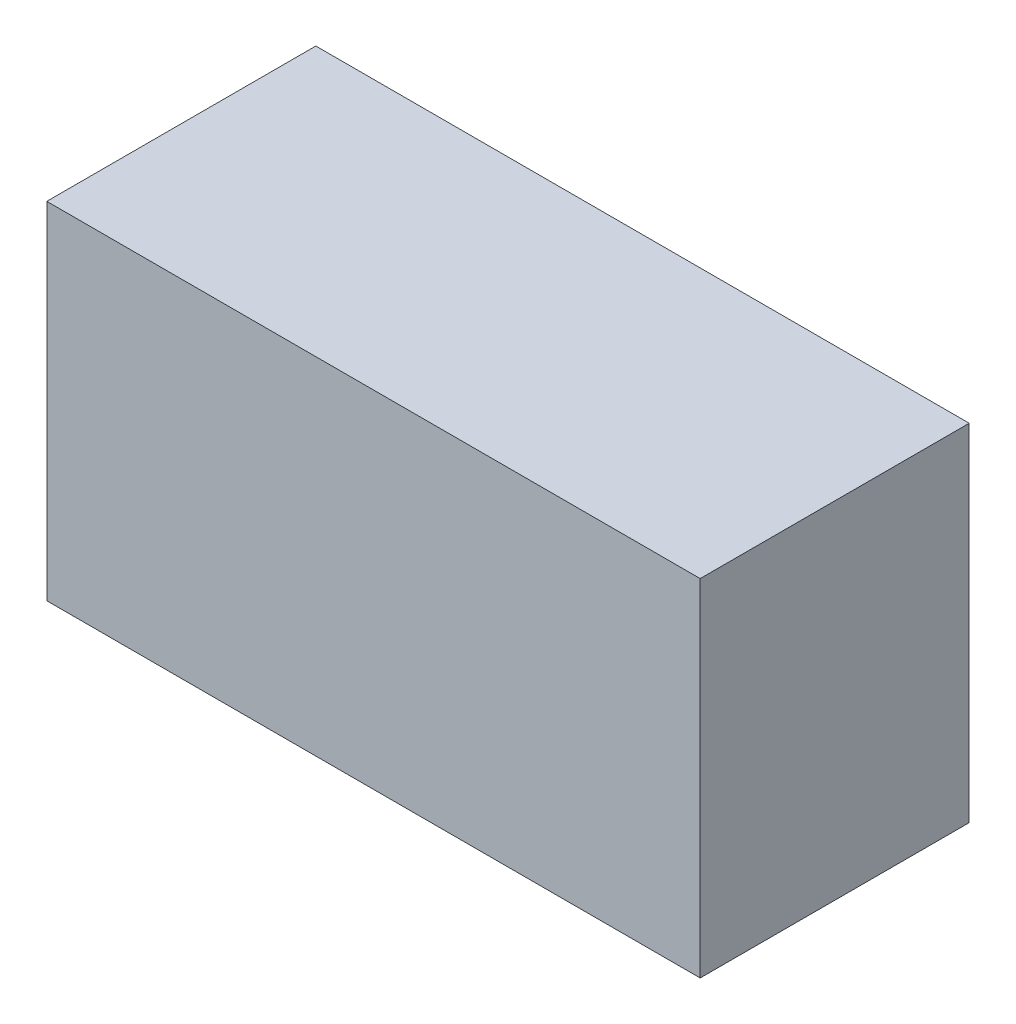
ISO-10303-21;
HEADER;
FILE_DESCRIPTION(('STEP AP214'),'2;1');
FILE_NAME('part.step','',(''),(''),'','','');
FILE_SCHEMA(('AUTOMOTIVE_DESIGN { 1 0 10303 214 1 1 1 1 }'));
ENDSEC;
DATA;
#1=APPLICATION_CONTEXT('core data for automotive mechanical design processes');
#2=APPLICATION_PROTOCOL_DEFINITION('international standard','automotive_design',2000,#1);
#3=PRODUCT_CONTEXT('',#1,'mechanical');
#4=PRODUCT('Part','Part','',(#3));
#5=PRODUCT_RELATED_PRODUCT_CATEGORY('part','',(#4));
#6=PRODUCT_DEFINITION_FORMATION('','',#4);
#7=PRODUCT_DEFINITION_CONTEXT('part definition',#1,'design');
#8=PRODUCT_DEFINITION('design','',#6,#7);
#9=PRODUCT_DEFINITION_SHAPE('','',#8);
#10=(LENGTH_UNIT() NAMED_UNIT(*) SI_UNIT(.MILLI.,.METRE.));
#11=(NAMED_UNIT(*) PLANE_ANGLE_UNIT() SI_UNIT($,.RADIAN.));
#12=(NAMED_UNIT(*) SI_UNIT($,.STERADIAN.) SOLID_ANGLE_UNIT());
#13=UNCERTAINTY_MEASURE_WITH_UNIT(LENGTH_MEASURE(1.E-05),#10,'distance_accuracy_value','');
#14=(GEOMETRIC_REPRESENTATION_CONTEXT(3) GLOBAL_UNCERTAINTY_ASSIGNED_CONTEXT((#13)) GLOBAL_UNIT_ASSIGNED_CONTEXT((#10,
#11,#12)) REPRESENTATION_CONTEXT('',''));
#15=CARTESIAN_POINT('',(0.,0.,0.));
#16=DIRECTION('',(0.,0.,1.));
#17=DIRECTION('',(1.,0.,0.));
#18=AXIS2_PLACEMENT_3D('',#15,#16,#17);
#19=CARTESIAN_POINT('',(42.5,-22.5,35.));
#20=DIRECTION('',(-1.,0.,0.));
#21=DIRECTION('',(0.,0.,1.));
#22=AXIS2_PLACEMENT_3D('',#19,#20,#21);
#23=PLANE('',#22);
#24=DIRECTION('',(0.,1.,0.));
#25=VECTOR('',#24,1.);
#26=CARTESIAN_POINT('',(42.5,-22.5,0.));
#27=LINE('',#26,#25);
#28=CARTESIAN_POINT('',(42.5,-22.5,0.));
#29=VERTEX_POINT('',#28);
#30=CARTESIAN_POINT('',(42.5,22.5,0.));
#31=VERTEX_POINT('',#30);
#32=EDGE_CURVE('E113',#29,#31,#27,.T.);
#33=ORIENTED_EDGE('',*,*,#32,.T.);
#34=DIRECTION('',(0.,0.,-1.));
#35=VECTOR('',#34,1.);
#36=CARTESIAN_POINT('',(42.5,22.5,35.));
#37=LINE('',#36,#35);
#38=CARTESIAN_POINT('',(42.5,22.5,35.));
#39=VERTEX_POINT('',#38);
#40=EDGE_CURVE('E11',#39,#31,#37,.T.);
#41=ORIENTED_EDGE('',*,*,#40,.F.);
#42=DIRECTION('',(0.,1.,0.));
#43=VECTOR('',#42,1.);
#44=CARTESIAN_POINT('',(42.5,-22.5,35.));
#45=LINE('',#44,#43);
#46=CARTESIAN_POINT('',(42.5,-22.5,35.));
#47=VERTEX_POINT('',#46);
#48=EDGE_CURVE('E97',#47,#39,#45,.T.);
#49=ORIENTED_EDGE('',*,*,#48,.F.);
#50=DIRECTION('',(0.,0.,-1.));
#51=VECTOR('',#50,1.);
#52=CARTESIAN_POINT('',(42.5,-22.5,35.));
#53=LINE('',#52,#51);
#54=EDGE_CURVE('E109',#47,#29,#53,.T.);
#55=ORIENTED_EDGE('',*,*,#54,.T.);
#56=EDGE_LOOP('',(#33,#41,#49,#55));
#57=FACE_BOUND('',#56,.T.);
#58=ADVANCED_FACE('F45',(#57),#23,.F.);
#59=CARTESIAN_POINT('',(-42.5,22.5,35.));
#60=DIRECTION('',(0.,-1.,0.));
#61=DIRECTION('',(0.,0.,-1.));
#62=AXIS2_PLACEMENT_3D('',#59,#60,#61);
#63=PLANE('',#62);
#64=DIRECTION('',(-1.,0.,0.));
#65=VECTOR('',#64,1.);
#66=CARTESIAN_POINT('',(-42.5,22.5,0.));
#67=LINE('',#66,#65);
#68=CARTESIAN_POINT('',(-42.5,22.5,0.));
#69=VERTEX_POINT('',#68);
#70=EDGE_CURVE('E102',#31,#69,#67,.T.);
#71=ORIENTED_EDGE('',*,*,#70,.T.);
#72=DIRECTION('',(0.,0.,-1.));
#73=VECTOR('',#72,1.);
#74=CARTESIAN_POINT('',(-42.5,22.5,35.));
#75=LINE('',#74,#73);
#76=CARTESIAN_POINT('',(-42.5,22.5,35.));
#77=VERTEX_POINT('',#76);
#78=EDGE_CURVE('E54',#77,#69,#75,.T.);
#79=ORIENTED_EDGE('',*,*,#78,.F.);
#80=DIRECTION('',(-1.,0.,0.));
#81=VECTOR('',#80,1.);
#82=CARTESIAN_POINT('',(-42.5,22.5,35.));
#83=LINE('',#82,#81);
#84=EDGE_CURVE('E92',#39,#77,#83,.T.);
#85=ORIENTED_EDGE('',*,*,#84,.F.);
#86=ORIENTED_EDGE('',*,*,#40,.T.);
#87=EDGE_LOOP('',(#71,#79,#85,#86));
#88=FACE_BOUND('',#87,.T.);
#89=ADVANCED_FACE('F101',(#88),#63,.F.);
#90=CARTESIAN_POINT('',(-42.5,-22.5,35.));
#91=DIRECTION('',(1.,0.,0.));
#92=DIRECTION('',(0.,0.,-1.));
#93=AXIS2_PLACEMENT_3D('',#90,#91,#92);
#94=PLANE('',#93);
#95=DIRECTION('',(0.,-1.,0.));
#96=VECTOR('',#95,1.);
#97=CARTESIAN_POINT('',(-42.5,-22.5,0.));
#98=LINE('',#97,#96);
#99=CARTESIAN_POINT('',(-42.5,-22.5,0.));
#100=VERTEX_POINT('',#99);
#101=EDGE_CURVE('E79',#69,#100,#98,.T.);
#102=ORIENTED_EDGE('',*,*,#101,.T.);
#103=DIRECTION('',(0.,0.,-1.));
#104=VECTOR('',#103,1.);
#105=CARTESIAN_POINT('',(-42.5,-22.5,35.));
#106=LINE('',#105,#104);
#107=CARTESIAN_POINT('',(-42.5,-22.5,35.));
#108=VERTEX_POINT('',#107);
#109=EDGE_CURVE('E104',#108,#100,#106,.T.);
#110=ORIENTED_EDGE('',*,*,#109,.F.);
#111=DIRECTION('',(0.,-1.,0.));
#112=VECTOR('',#111,1.);
#113=CARTESIAN_POINT('',(-42.5,-22.5,35.));
#114=LINE('',#113,#112);
#115=EDGE_CURVE('E95',#77,#108,#114,.T.);
#116=ORIENTED_EDGE('',*,*,#115,.F.);
#117=ORIENTED_EDGE('',*,*,#78,.T.);
#118=EDGE_LOOP('',(#102,#110,#116,#117));
#119=FACE_BOUND('',#118,.T.);
#120=ADVANCED_FACE('F105',(#119),#94,.F.);
#121=CARTESIAN_POINT('',(-42.5,-22.5,35.));
#122=DIRECTION('',(0.,1.,0.));
#123=DIRECTION('',(0.,0.,1.));
#124=AXIS2_PLACEMENT_3D('',#121,#122,#123);
#125=PLANE('',#124);
#126=DIRECTION('',(1.,0.,0.));
#127=VECTOR('',#126,1.);
#128=CARTESIAN_POINT('',(-42.5,-22.5,0.));
#129=LINE('',#128,#127);
#130=EDGE_CURVE('E85',#100,#29,#129,.T.);
#131=ORIENTED_EDGE('',*,*,#130,.T.);
#132=ORIENTED_EDGE('',*,*,#54,.F.);
#133=DIRECTION('',(1.,0.,0.));
#134=VECTOR('',#133,1.);
#135=CARTESIAN_POINT('',(-42.5,-22.5,35.));
#136=LINE('',#135,#134);
#137=EDGE_CURVE('E62',#108,#47,#136,.T.);
#138=ORIENTED_EDGE('',*,*,#137,.F.);
#139=ORIENTED_EDGE('',*,*,#109,.T.);
#140=EDGE_LOOP('',(#131,#132,#138,#139));
#141=FACE_BOUND('',#140,.T.);
#142=ADVANCED_FACE('F126',(#141),#125,.F.);
#143=CARTESIAN_POINT('',(0.,0.,35.));
#144=DIRECTION('',(0.,0.,-1.));
#145=DIRECTION('',(-1.,0.,0.));
#146=AXIS2_PLACEMENT_3D('',#143,#144,#145);
#147=PLANE('',#146);
#148=ORIENTED_EDGE('',*,*,#48,.T.);
#149=ORIENTED_EDGE('',*,*,#84,.T.);
#150=ORIENTED_EDGE('',*,*,#115,.T.);
#151=ORIENTED_EDGE('',*,*,#137,.T.);
#152=EDGE_LOOP('',(#148,#149,#150,#151));
#153=FACE_BOUND('',#152,.T.);
#154=ADVANCED_FACE('F93',(#153),#147,.F.);
#155=CARTESIAN_POINT('',(0.,0.,0.));
#156=DIRECTION('',(0.,0.,-1.));
#157=DIRECTION('',(-1.,0.,0.));
#158=AXIS2_PLACEMENT_3D('',#155,#156,#157);
#159=PLANE('',#158);
#160=ORIENTED_EDGE('',*,*,#32,.F.);
#161=ORIENTED_EDGE('',*,*,#130,.F.);
#162=ORIENTED_EDGE('',*,*,#101,.F.);
#163=ORIENTED_EDGE('',*,*,#70,.F.);
#164=EDGE_LOOP('',(#160,#161,#162,#163));
#165=FACE_BOUND('',#164,.T.);
#166=ADVANCED_FACE('F129',(#165),#159,.T.);
#167=CLOSED_SHELL('',(#58,#89,#120,#142,#154,#166));
#168=MANIFOLD_SOLID_BREP('B2',#167);
#169=ADVANCED_BREP_SHAPE_REPRESENTATION('',(#18,#168),#14);
#170=SHAPE_DEFINITION_REPRESENTATION(#9,#169);
ENDSEC;
END-ISO-10303-21;
